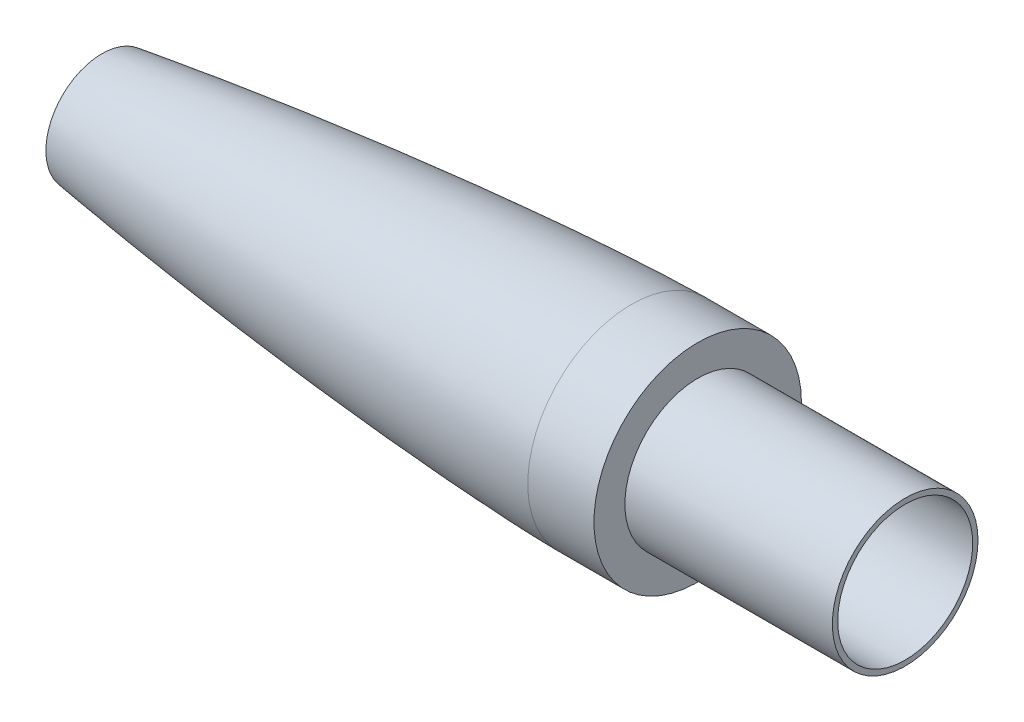
ISO-10303-21;
HEADER;
FILE_DESCRIPTION(('STEP AP214'),'2;1');
FILE_NAME('part.step','',(''),(''),'','','');
FILE_SCHEMA(('AUTOMOTIVE_DESIGN { 1 0 10303 214 1 1 1 1 }'));
ENDSEC;
DATA;
#1=APPLICATION_CONTEXT('core data for automotive mechanical design processes');
#2=APPLICATION_PROTOCOL_DEFINITION('international standard','automotive_design',2000,#1);
#3=PRODUCT_CONTEXT('',#1,'mechanical');
#4=PRODUCT('Part','Part','',(#3));
#5=PRODUCT_RELATED_PRODUCT_CATEGORY('part','',(#4));
#6=PRODUCT_DEFINITION_FORMATION('','',#4);
#7=PRODUCT_DEFINITION_CONTEXT('part definition',#1,'design');
#8=PRODUCT_DEFINITION('design','',#6,#7);
#9=PRODUCT_DEFINITION_SHAPE('','',#8);
#10=(LENGTH_UNIT() NAMED_UNIT(*) SI_UNIT(.MILLI.,.METRE.));
#11=(NAMED_UNIT(*) PLANE_ANGLE_UNIT() SI_UNIT($,.RADIAN.));
#12=(NAMED_UNIT(*) SI_UNIT($,.STERADIAN.) SOLID_ANGLE_UNIT());
#13=UNCERTAINTY_MEASURE_WITH_UNIT(LENGTH_MEASURE(1.E-05),#10,'distance_accuracy_value','');
#14=(GEOMETRIC_REPRESENTATION_CONTEXT(3) GLOBAL_UNCERTAINTY_ASSIGNED_CONTEXT((#13)) GLOBAL_UNIT_ASSIGNED_CONTEXT((#10,
#11,#12)) REPRESENTATION_CONTEXT('',''));
#15=CARTESIAN_POINT('',(0.,0.,0.));
#16=DIRECTION('',(0.,0.,1.));
#17=DIRECTION('',(1.,0.,0.));
#18=AXIS2_PLACEMENT_3D('',#15,#16,#17);
#19=CARTESIAN_POINT('',(0.,0.,0.));
#20=CARTESIAN_POINT('',(0.0016487257899739,0.00637767165344409,0.));
#21=CARTESIAN_POINT('',(0.0057621718653015,0.0188021593914274,0.));
#22=CARTESIAN_POINT('',(0.0175123313243743,0.0422493817570645,0.));
#23=CARTESIAN_POINT('',(0.046253840596632,0.0861642592508907,0.));
#24=CARTESIAN_POINT('',(0.0914748777391001,0.142292386652359,0.));
#25=CARTESIAN_POINT('',(0.154274348482774,0.20912514537751,0.));
#26=CARTESIAN_POINT('',(0.276301441633623,0.324701770965458,0.));
#27=CARTESIAN_POINT('',(0.421122579930573,0.443291574190418,0.));
#28=CARTESIAN_POINT('',(0.586286455480629,0.566464418607899,0.));
#29=CARTESIAN_POINT('',(0.83951343193514,0.741034702086761,0.));
#30=CARTESIAN_POINT('',(1.18296840036321,0.960203667032714,0.));
#31=CARTESIAN_POINT('',(1.78280966033623,1.30866238394851,0.));
#32=CARTESIAN_POINT('',(2.86829695281267,1.87162382715185,0.));
#33=CARTESIAN_POINT('',(4.76277782522134,2.73974077748204,0.));
#34=CARTESIAN_POINT('',(8.19028565992219,4.11595910205271,0.));
#35=CARTESIAN_POINT('',(14.422968110472,6.28797056713511,0.));
#36=CARTESIAN_POINT('',(24.8043027546662,9.40768115367406,0.));
#37=CARTESIAN_POINT('',(38.8994962833824,13.087626071966,0.));
#38=CARTESIAN_POINT('',(55.9277376029872,17.0568128067629,0.));
#39=CARTESIAN_POINT('',(79.0908104498615,21.9783504080432,0.));
#40=CARTESIAN_POINT('',(106.881185800737,27.3295948783205,0.));
#41=CARTESIAN_POINT('',(139.404169497215,33.0214355719504,0.));
#42=CARTESIAN_POINT('',(176.668348452349,38.9538903494959,0.));
#43=CARTESIAN_POINT('',(214.003857084132,44.4168991341357,0.));
#44=CARTESIAN_POINT('',(251.396751983993,49.471116429039,0.));
#45=CARTESIAN_POINT('',(288.837779512109,54.1545255374062,0.));
#46=CARTESIAN_POINT('',(326.320734140861,58.4892815739677,0.));
#47=CARTESIAN_POINT('',(363.841177132752,62.4863121261995,0.));
#48=CARTESIAN_POINT('',(401.39599420768,66.1465092198773,0.));
#49=CARTESIAN_POINT('',(438.982971251084,69.4606087355129,0.));
#50=CARTESIAN_POINT('',(476.600652970697,72.4071093826599,0.));
#51=CARTESIAN_POINT('',(509.542265690245,74.6286978107565,0.));
#52=CARTESIAN_POINT('',(537.796481138977,76.2335046528282,0.));
#53=CARTESIAN_POINT('',(560.292262180115,77.2754594007759,0.));
#54=CARTESIAN_POINT('',(575.19535670378,77.8326432804356,0.));
#55=CARTESIAN_POINT('',(587.214225045065,78.1730067265653,0.));
#56=CARTESIAN_POINT('',(594.51997618939,78.3103558818441,0.));
#57=CARTESIAN_POINT('',(598.173256760109,78.3543246601118,0.));
#58=CARTESIAN_POINT('',(600.,78.36,0.));
#59=B_SPLINE_CURVE_WITH_KNOTS('',4,(#19,#20,#21,#22,#23,#24,#25,#26,#27,#28,#29,#30,#31,#32,#33,
#34,#35,#36,#37,#38,#39,#40,#41,#42,#43,#44,#45,#46,#47,#48,#49,#50,#51,#52,#53,#54,#55,#56,#57,
#58),.UNSPECIFIED.,.F.,.F.,(5,1,1,1,1,1,1,1,1,1,1,1,1,1,1,1,1,1,1,1,1,1,1,1,1,1,1,1,1,1,1,1,1,1,
1,1,5),(0.,4.31412316187256E-05,8.62824632374512E-05,0.000172564926474902,0.000345129852949805,
0.000517694779424707,0.000690259705899609,0.00127990506767294,0.00157768305463857,
0.0018754610416042,0.00271726976481212,0.00396472959905857,0.00614862348380284,
0.00993227852523749,0.0164479418553174,0.028301298247299,0.0496396283350756,0.0813631631901833,
0.112451510280435,0.143539857370687,0.20571657333025,0.267893284077703,0.330069994858809,
0.392246705900878,0.454423416608389,0.516600127206857,0.578776840412764,0.640953551735382,
0.703130263297214,0.765306975424274,0.827483686980578,0.889660398581477,0.920748754835595,
0.951837111089712,0.975918555544856,0.987959277772428,1.),.UNSPECIFIED.);
#60=CARTESIAN_POINT('',(806.72,0.,0.));
#61=DIRECTION('',(1.,0.,0.));
#62=AXIS1_PLACEMENT('',#60,#61);
#63=SURFACE_OF_REVOLUTION('',#59,#62);
#64=CARTESIAN_POINT('',(600.,0.,0.));
#65=DIRECTION('',(1.,0.,0.));
#66=DIRECTION('',(0.,0.,-1.));
#67=AXIS2_PLACEMENT_3D('',#64,#65,#66);
#68=CIRCLE('',#67,78.36);
#69=CARTESIAN_POINT('',(600.,0.,-78.36));
#70=VERTEX_POINT('',#69);
#71=EDGE_CURVE('E57',#70,#70,#68,.T.);
#72=ORIENTED_EDGE('',*,*,#71,.F.);
#73=EDGE_LOOP('',(#72));
#74=FACE_BOUND('',#73,.T.);
#75=CARTESIAN_POINT('',(200.000000000004,0.,0.));
#76=DIRECTION('',(1.,0.,0.));
#77=DIRECTION('',(0.,0.,-1.));
#78=AXIS2_PLACEMENT_3D('',#75,#76,#77);
#79=CIRCLE('',#78,42.3282803701014);
#80=CARTESIAN_POINT('',(200.000000000004,0.,-42.3282803701014));
#81=VERTEX_POINT('',#80);
#82=EDGE_CURVE('E10',#81,#81,#79,.T.);
#83=ORIENTED_EDGE('',*,*,#82,.T.);
#84=EDGE_LOOP('',(#83));
#85=FACE_BOUND('',#84,.T.);
#86=ADVANCED_FACE('F37',(#74,#85),#63,.T.);
#87=CARTESIAN_POINT('',(200.000000000003,-1.70487664440081E-11,0.));
#88=DIRECTION('',(1.,0.,0.));
#89=DIRECTION('',(0.,0.,-1.));
#90=AXIS2_PLACEMENT_3D('',#87,#88,#89);
#91=PLANE('',#90);
#92=CARTESIAN_POINT('',(200.000000000003,0.,0.));
#93=DIRECTION('',(-1.,0.,0.));
#94=DIRECTION('',(0.,0.,1.));
#95=AXIS2_PLACEMENT_3D('',#92,#93,#94);
#96=CIRCLE('',#95,33.);
#97=CARTESIAN_POINT('',(200.000000000003,0.,33.));
#98=VERTEX_POINT('',#97);
#99=EDGE_CURVE('E73',#98,#98,#96,.T.);
#100=ORIENTED_EDGE('',*,*,#99,.F.);
#101=EDGE_LOOP('',(#100));
#102=FACE_BOUND('',#101,.T.);
#103=ORIENTED_EDGE('',*,*,#82,.F.);
#104=EDGE_LOOP('',(#103));
#105=FACE_BOUND('',#104,.T.);
#106=ADVANCED_FACE('F108',(#102,#105),#91,.F.);
#107=CARTESIAN_POINT('',(806.72,0.,0.));
#108=DIRECTION('',(-1.,0.,0.));
#109=DIRECTION('',(0.,0.,1.));
#110=AXIS2_PLACEMENT_3D('',#107,#108,#109);
#111=PLANE('',#110);
#112=CARTESIAN_POINT('',(806.72,0.,0.));
#113=DIRECTION('',(1.,0.,0.));
#114=DIRECTION('',(0.,0.,-1.));
#115=AXIS2_PLACEMENT_3D('',#112,#113,#114);
#116=CIRCLE('',#115,51.);
#117=CARTESIAN_POINT('',(806.72,0.,-51.));
#118=VERTEX_POINT('',#117);
#119=EDGE_CURVE('E64',#118,#118,#116,.T.);
#120=ORIENTED_EDGE('',*,*,#119,.F.);
#121=EDGE_LOOP('',(#120));
#122=FACE_BOUND('',#121,.T.);
#123=CARTESIAN_POINT('',(806.72,0.,0.));
#124=DIRECTION('',(1.,0.,0.));
#125=DIRECTION('',(0.,0.,-1.));
#126=AXIS2_PLACEMENT_3D('',#123,#124,#125);
#127=CIRCLE('',#126,55.);
#128=CARTESIAN_POINT('',(806.72,0.,-55.));
#129=VERTEX_POINT('',#128);
#130=EDGE_CURVE('E44',#129,#129,#127,.T.);
#131=ORIENTED_EDGE('',*,*,#130,.T.);
#132=EDGE_LOOP('',(#131));
#133=FACE_BOUND('',#132,.T.);
#134=ADVANCED_FACE('F111',(#122,#133),#111,.F.);
#135=CARTESIAN_POINT('',(806.72,0.,0.));
#136=DIRECTION('',(1.,0.,0.));
#137=DIRECTION('',(0.,0.,-1.));
#138=AXIS2_PLACEMENT_3D('',#135,#136,#137);
#139=CYLINDRICAL_SURFACE('',#138,55.);
#140=ORIENTED_EDGE('',*,*,#130,.F.);
#141=EDGE_LOOP('',(#140));
#142=FACE_BOUND('',#141,.T.);
#143=CARTESIAN_POINT('',(650.,0.,0.));
#144=DIRECTION('',(1.,0.,0.));
#145=DIRECTION('',(0.,0.,-1.));
#146=AXIS2_PLACEMENT_3D('',#143,#144,#145);
#147=CIRCLE('',#146,55.);
#148=CARTESIAN_POINT('',(650.,0.,-55.));
#149=VERTEX_POINT('',#148);
#150=EDGE_CURVE('E48',#149,#149,#147,.T.);
#151=ORIENTED_EDGE('',*,*,#150,.T.);
#152=EDGE_LOOP('',(#151));
#153=FACE_BOUND('',#152,.T.);
#154=ADVANCED_FACE('F116',(#142,#153),#139,.T.);
#155=CARTESIAN_POINT('',(650.,0.,0.));
#156=DIRECTION('',(-1.,0.,0.));
#157=DIRECTION('',(0.,0.,1.));
#158=AXIS2_PLACEMENT_3D('',#155,#156,#157);
#159=PLANE('',#158);
#160=ORIENTED_EDGE('',*,*,#150,.F.);
#161=EDGE_LOOP('',(#160));
#162=FACE_BOUND('',#161,.T.);
#163=CARTESIAN_POINT('',(650.,0.,0.));
#164=DIRECTION('',(1.,0.,0.));
#165=DIRECTION('',(0.,0.,-1.));
#166=AXIS2_PLACEMENT_3D('',#163,#164,#165);
#167=CIRCLE('',#166,78.36);
#168=CARTESIAN_POINT('',(650.,0.,-78.36));
#169=VERTEX_POINT('',#168);
#170=EDGE_CURVE('E52',#169,#169,#167,.T.);
#171=ORIENTED_EDGE('',*,*,#170,.T.);
#172=EDGE_LOOP('',(#171));
#173=FACE_BOUND('',#172,.T.);
#174=ADVANCED_FACE('F123',(#162,#173),#159,.F.);
#175=CARTESIAN_POINT('',(806.72,0.,0.));
#176=DIRECTION('',(1.,0.,0.));
#177=DIRECTION('',(0.,0.,-1.));
#178=AXIS2_PLACEMENT_3D('',#175,#176,#177);
#179=CYLINDRICAL_SURFACE('',#178,78.36);
#180=ORIENTED_EDGE('',*,*,#170,.F.);
#181=EDGE_LOOP('',(#180));
#182=FACE_BOUND('',#181,.T.);
#183=ORIENTED_EDGE('',*,*,#71,.T.);
#184=EDGE_LOOP('',(#183));
#185=FACE_BOUND('',#184,.T.);
#186=ADVANCED_FACE('F127',(#182,#185),#179,.T.);
#187=CARTESIAN_POINT('',(406.72,0.,0.));
#188=DIRECTION('',(1.,0.,0.));
#189=DIRECTION('',(0.,0.,-1.));
#190=AXIS2_PLACEMENT_3D('',#187,#188,#189);
#191=CYLINDRICAL_SURFACE('',#190,51.);
#192=CARTESIAN_POINT('',(406.72,0.,0.));
#193=DIRECTION('',(1.,0.,0.));
#194=DIRECTION('',(0.,0.,-1.));
#195=AXIS2_PLACEMENT_3D('',#192,#193,#194);
#196=CIRCLE('',#195,51.);
#197=CARTESIAN_POINT('',(406.72,0.,-51.));
#198=VERTEX_POINT('',#197);
#199=EDGE_CURVE('E59',#198,#198,#196,.T.);
#200=ORIENTED_EDGE('',*,*,#199,.F.);
#201=EDGE_LOOP('',(#200));
#202=FACE_BOUND('',#201,.T.);
#203=ORIENTED_EDGE('',*,*,#119,.T.);
#204=EDGE_LOOP('',(#203));
#205=FACE_BOUND('',#204,.T.);
#206=ADVANCED_FACE('F131',(#202,#205),#191,.F.);
#207=CARTESIAN_POINT('',(406.72,0.,0.));
#208=DIRECTION('',(1.,0.,0.));
#209=DIRECTION('',(0.,0.,-1.));
#210=AXIS2_PLACEMENT_3D('',#207,#208,#209);
#211=PLANE('',#210);
#212=CARTESIAN_POINT('',(406.72,20.,0.));
#213=DIRECTION('',(1.,0.,0.));
#214=DIRECTION('',(0.,0.,-1.));
#215=AXIS2_PLACEMENT_3D('',#212,#213,#214);
#216=CIRCLE('',#215,3.1);
#217=CARTESIAN_POINT('',(406.72,20.,-3.1));
#218=VERTEX_POINT('',#217);
#219=EDGE_CURVE('E76',#218,#218,#216,.T.);
#220=ORIENTED_EDGE('',*,*,#219,.F.);
#221=EDGE_LOOP('',(#220));
#222=FACE_BOUND('',#221,.T.);
#223=CARTESIAN_POINT('',(406.72,-20.,0.));
#224=DIRECTION('',(1.,0.,0.));
#225=DIRECTION('',(0.,0.,-1.));
#226=AXIS2_PLACEMENT_3D('',#223,#224,#225);
#227=CIRCLE('',#226,3.1);
#228=CARTESIAN_POINT('',(406.72,-20.,-3.1));
#229=VERTEX_POINT('',#228);
#230=EDGE_CURVE('E84',#229,#229,#227,.T.);
#231=ORIENTED_EDGE('',*,*,#230,.F.);
#232=EDGE_LOOP('',(#231));
#233=FACE_BOUND('',#232,.T.);
#234=ORIENTED_EDGE('',*,*,#199,.T.);
#235=EDGE_LOOP('',(#234));
#236=FACE_BOUND('',#235,.T.);
#237=ADVANCED_FACE('F104',(#222,#233,#236),#211,.T.);
#238=CARTESIAN_POINT('',(240.000000000003,0.,0.));
#239=DIRECTION('',(-1.,0.,0.));
#240=DIRECTION('',(0.,0.,1.));
#241=AXIS2_PLACEMENT_3D('',#238,#239,#240);
#242=CYLINDRICAL_SURFACE('',#241,33.);
#243=CARTESIAN_POINT('',(240.000000000003,0.,0.));
#244=DIRECTION('',(-1.,0.,0.));
#245=DIRECTION('',(0.,0.,1.));
#246=AXIS2_PLACEMENT_3D('',#243,#244,#245);
#247=CIRCLE('',#246,33.);
#248=CARTESIAN_POINT('',(240.000000000003,0.,33.));
#249=VERTEX_POINT('',#248);
#250=EDGE_CURVE('E70',#249,#249,#247,.T.);
#251=ORIENTED_EDGE('',*,*,#250,.F.);
#252=EDGE_LOOP('',(#251));
#253=FACE_BOUND('',#252,.T.);
#254=ORIENTED_EDGE('',*,*,#99,.T.);
#255=EDGE_LOOP('',(#254));
#256=FACE_BOUND('',#255,.T.);
#257=ADVANCED_FACE('F96',(#253,#256),#242,.F.);
#258=CARTESIAN_POINT('',(240.000000000003,0.,0.));
#259=DIRECTION('',(-1.,0.,0.));
#260=DIRECTION('',(0.,0.,1.));
#261=AXIS2_PLACEMENT_3D('',#258,#259,#260);
#262=PLANE('',#261);
#263=CARTESIAN_POINT('',(240.000000000003,-20.,0.));
#264=DIRECTION('',(-1.,0.,0.));
#265=DIRECTION('',(0.,0.,1.));
#266=AXIS2_PLACEMENT_3D('',#263,#264,#265);
#267=CIRCLE('',#266,3.1);
#268=CARTESIAN_POINT('',(240.000000000003,-20.,3.1));
#269=VERTEX_POINT('',#268);
#270=EDGE_CURVE('E87',#269,#269,#267,.T.);
#271=ORIENTED_EDGE('',*,*,#270,.F.);
#272=EDGE_LOOP('',(#271));
#273=FACE_BOUND('',#272,.T.);
#274=CARTESIAN_POINT('',(240.000000000003,20.,0.));
#275=DIRECTION('',(-1.,0.,0.));
#276=DIRECTION('',(0.,0.,1.));
#277=AXIS2_PLACEMENT_3D('',#274,#275,#276);
#278=CIRCLE('',#277,3.1);
#279=CARTESIAN_POINT('',(240.000000000003,20.,3.1));
#280=VERTEX_POINT('',#279);
#281=EDGE_CURVE('E81',#280,#280,#278,.T.);
#282=ORIENTED_EDGE('',*,*,#281,.F.);
#283=EDGE_LOOP('',(#282));
#284=FACE_BOUND('',#283,.T.);
#285=ORIENTED_EDGE('',*,*,#250,.T.);
#286=EDGE_LOOP('',(#285));
#287=FACE_BOUND('',#286,.T.);
#288=ADVANCED_FACE('F93',(#273,#284,#287),#262,.T.);
#289=CARTESIAN_POINT('',(806.72,-20.,0.));
#290=DIRECTION('',(-1.,0.,0.));
#291=DIRECTION('',(0.,0.,1.));
#292=AXIS2_PLACEMENT_3D('',#289,#290,#291);
#293=CYLINDRICAL_SURFACE('',#292,3.1);
#294=ORIENTED_EDGE('',*,*,#230,.T.);
#295=EDGE_LOOP('',(#294));
#296=FACE_BOUND('',#295,.T.);
#297=ORIENTED_EDGE('',*,*,#270,.T.);
#298=EDGE_LOOP('',(#297));
#299=FACE_BOUND('',#298,.T.);
#300=ADVANCED_FACE('F91',(#296,#299),#293,.F.);
#301=CARTESIAN_POINT('',(806.72,20.,0.));
#302=DIRECTION('',(-1.,0.,0.));
#303=DIRECTION('',(0.,0.,1.));
#304=AXIS2_PLACEMENT_3D('',#301,#302,#303);
#305=CYLINDRICAL_SURFACE('',#304,3.1);
#306=ORIENTED_EDGE('',*,*,#219,.T.);
#307=EDGE_LOOP('',(#306));
#308=FACE_BOUND('',#307,.T.);
#309=ORIENTED_EDGE('',*,*,#281,.T.);
#310=EDGE_LOOP('',(#309));
#311=FACE_BOUND('',#310,.T.);
#312=ADVANCED_FACE('F141',(#308,#311),#305,.F.);
#313=CLOSED_SHELL('',(#86,#106,#134,#154,#174,#186,#206,#237,#257,#288,#300,#312));
#314=MANIFOLD_SOLID_BREP('B2',#313);
#315=ADVANCED_BREP_SHAPE_REPRESENTATION('',(#18,#314),#14);
#316=SHAPE_DEFINITION_REPRESENTATION(#9,#315);
ENDSEC;
END-ISO-10303-21;
